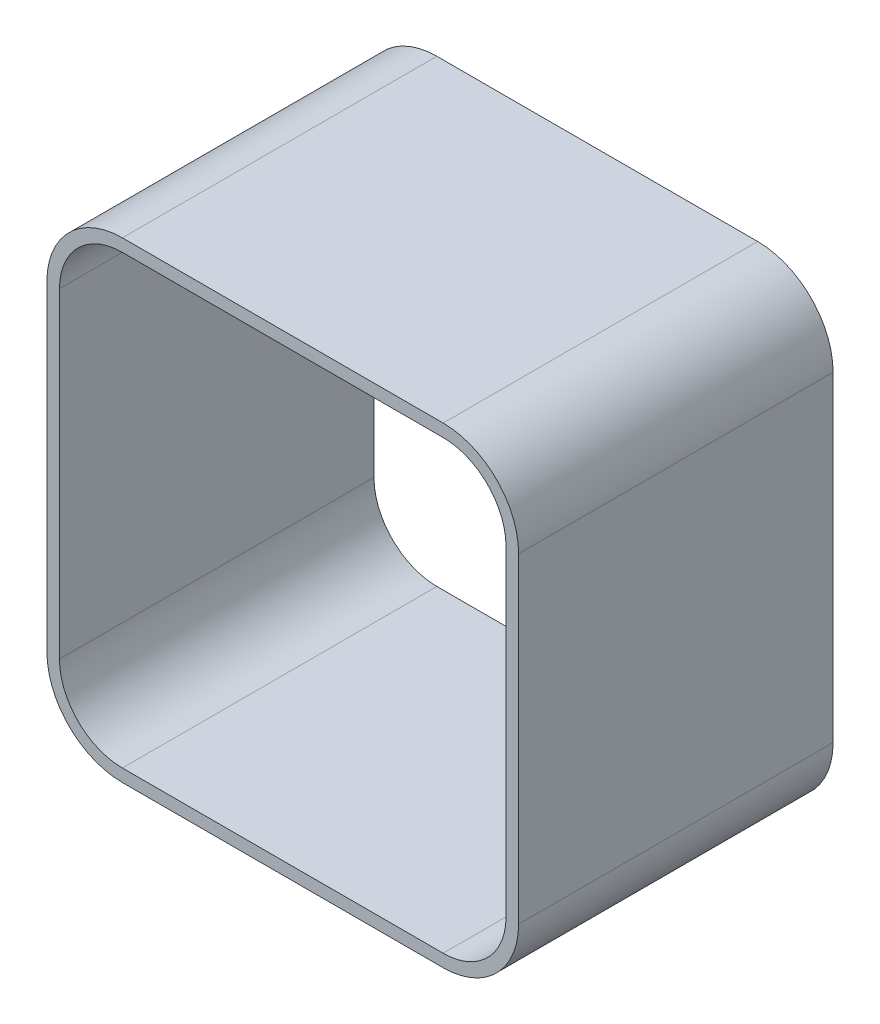
ISO-10303-21;
HEADER;
FILE_DESCRIPTION(('STEP AP214'),'2;1');
FILE_NAME('part.step','',(''),(''),'','','');
FILE_SCHEMA(('AUTOMOTIVE_DESIGN { 1 0 10303 214 1 1 1 1 }'));
ENDSEC;
DATA;
#1=APPLICATION_CONTEXT('core data for automotive mechanical design processes');
#2=APPLICATION_PROTOCOL_DEFINITION('international standard','automotive_design',2000,#1);
#3=PRODUCT_CONTEXT('',#1,'mechanical');
#4=PRODUCT('Part','Part','',(#3));
#5=PRODUCT_RELATED_PRODUCT_CATEGORY('part','',(#4));
#6=PRODUCT_DEFINITION_FORMATION('','',#4);
#7=PRODUCT_DEFINITION_CONTEXT('part definition',#1,'design');
#8=PRODUCT_DEFINITION('design','',#6,#7);
#9=PRODUCT_DEFINITION_SHAPE('','',#8);
#10=(LENGTH_UNIT() NAMED_UNIT(*) SI_UNIT(.MILLI.,.METRE.));
#11=(NAMED_UNIT(*) PLANE_ANGLE_UNIT() SI_UNIT($,.RADIAN.));
#12=(NAMED_UNIT(*) SI_UNIT($,.STERADIAN.) SOLID_ANGLE_UNIT());
#13=UNCERTAINTY_MEASURE_WITH_UNIT(LENGTH_MEASURE(1.E-05),#10,'distance_accuracy_value','');
#14=(GEOMETRIC_REPRESENTATION_CONTEXT(3) GLOBAL_UNCERTAINTY_ASSIGNED_CONTEXT((#13)) GLOBAL_UNIT_ASSIGNED_CONTEXT((#10,
#11,#12)) REPRESENTATION_CONTEXT('',''));
#15=CARTESIAN_POINT('',(0.,0.,0.));
#16=DIRECTION('',(0.,0.,1.));
#17=DIRECTION('',(1.,0.,0.));
#18=AXIS2_PLACEMENT_3D('',#15,#16,#17);
#19=CARTESIAN_POINT('',(0.,0.,10.));
#20=DIRECTION('',(0.,0.,1.));
#21=DIRECTION('',(1.,0.,0.));
#22=AXIS2_PLACEMENT_3D('',#19,#20,#21);
#23=PLANE('',#22);
#24=DIRECTION('',(-1.,0.,0.));
#25=VECTOR('',#24,1.);
#26=CARTESIAN_POINT('',(-7.5,7.5,10.));
#27=LINE('',#26,#25);
#28=CARTESIAN_POINT('',(5.1,7.5,10.));
#29=VERTEX_POINT('',#28);
#30=CARTESIAN_POINT('',(-5.1,7.5,10.));
#31=VERTEX_POINT('',#30);
#32=EDGE_CURVE('E248',#29,#31,#27,.T.);
#33=ORIENTED_EDGE('',*,*,#32,.T.);
#34=CARTESIAN_POINT('',(-5.1,5.1,10.));
#35=DIRECTION('',(0.,0.,1.));
#36=DIRECTION('',(1.,0.,0.));
#37=AXIS2_PLACEMENT_3D('',#34,#35,#36);
#38=CIRCLE('',#37,2.4);
#39=CARTESIAN_POINT('',(-7.5,5.1,10.));
#40=VERTEX_POINT('',#39);
#41=EDGE_CURVE('E230',#31,#40,#38,.T.);
#42=ORIENTED_EDGE('',*,*,#41,.T.);
#43=DIRECTION('',(0.,-1.,0.));
#44=VECTOR('',#43,1.);
#45=CARTESIAN_POINT('',(-7.5,7.5,10.));
#46=LINE('',#45,#44);
#47=CARTESIAN_POINT('',(-7.5,-5.1,10.));
#48=VERTEX_POINT('',#47);
#49=EDGE_CURVE('E176',#40,#48,#46,.T.);
#50=ORIENTED_EDGE('',*,*,#49,.T.);
#51=CARTESIAN_POINT('',(-5.1,-5.1,10.));
#52=DIRECTION('',(0.,0.,1.));
#53=DIRECTION('',(1.,0.,0.));
#54=AXIS2_PLACEMENT_3D('',#51,#52,#53);
#55=CIRCLE('',#54,2.4);
#56=CARTESIAN_POINT('',(-5.1,-7.5,10.));
#57=VERTEX_POINT('',#56);
#58=EDGE_CURVE('E53',#48,#57,#55,.T.);
#59=ORIENTED_EDGE('',*,*,#58,.T.);
#60=DIRECTION('',(1.,0.,0.));
#61=VECTOR('',#60,1.);
#62=CARTESIAN_POINT('',(-7.5,-7.5,10.));
#63=LINE('',#62,#61);
#64=CARTESIAN_POINT('',(5.1,-7.5,10.));
#65=VERTEX_POINT('',#64);
#66=EDGE_CURVE('E172',#57,#65,#63,.T.);
#67=ORIENTED_EDGE('',*,*,#66,.T.);
#68=CARTESIAN_POINT('',(5.1,-5.1,10.));
#69=DIRECTION('',(0.,0.,1.));
#70=DIRECTION('',(1.,0.,0.));
#71=AXIS2_PLACEMENT_3D('',#68,#69,#70);
#72=CIRCLE('',#71,2.4);
#73=CARTESIAN_POINT('',(7.5,-5.1,10.));
#74=VERTEX_POINT('',#73);
#75=EDGE_CURVE('E226',#65,#74,#72,.T.);
#76=ORIENTED_EDGE('',*,*,#75,.T.);
#77=DIRECTION('',(0.,1.,0.));
#78=VECTOR('',#77,1.);
#79=CARTESIAN_POINT('',(7.5,7.5,10.));
#80=LINE('',#79,#78);
#81=CARTESIAN_POINT('',(7.5,5.1,10.));
#82=VERTEX_POINT('',#81);
#83=EDGE_CURVE('E245',#74,#82,#80,.T.);
#84=ORIENTED_EDGE('',*,*,#83,.T.);
#85=CARTESIAN_POINT('',(5.1,5.1,10.));
#86=DIRECTION('',(0.,0.,1.));
#87=DIRECTION('',(1.,0.,0.));
#88=AXIS2_PLACEMENT_3D('',#85,#86,#87);
#89=CIRCLE('',#88,2.4);
#90=EDGE_CURVE('E228',#82,#29,#89,.T.);
#91=ORIENTED_EDGE('',*,*,#90,.T.);
#92=EDGE_LOOP('',(#33,#42,#50,#59,#67,#76,#84,#91));
#93=FACE_BOUND('',#92,.T.);
#94=DIRECTION('',(-1.,0.,0.));
#95=VECTOR('',#94,1.);
#96=CARTESIAN_POINT('',(-7.1,7.1,10.));
#97=LINE('',#96,#95);
#98=CARTESIAN_POINT('',(5.1,7.1,10.));
#99=VERTEX_POINT('',#98);
#100=CARTESIAN_POINT('',(-5.1,7.1,10.));
#101=VERTEX_POINT('',#100);
#102=EDGE_CURVE('E273',#99,#101,#97,.T.);
#103=ORIENTED_EDGE('',*,*,#102,.F.);
#104=CARTESIAN_POINT('',(5.1,5.1,10.));
#105=DIRECTION('',(0.,0.,1.));
#106=DIRECTION('',(1.,0.,0.));
#107=AXIS2_PLACEMENT_3D('',#104,#105,#106);
#108=CIRCLE('',#107,2.);
#109=CARTESIAN_POINT('',(7.1,5.1,10.));
#110=VERTEX_POINT('',#109);
#111=EDGE_CURVE('E158',#99,#110,#108,.F.);
#112=ORIENTED_EDGE('',*,*,#111,.T.);
#113=DIRECTION('',(0.,1.,0.));
#114=VECTOR('',#113,1.);
#115=CARTESIAN_POINT('',(7.1,7.1,10.));
#116=LINE('',#115,#114);
#117=CARTESIAN_POINT('',(7.1,-5.1,10.));
#118=VERTEX_POINT('',#117);
#119=EDGE_CURVE('E263',#118,#110,#116,.T.);
#120=ORIENTED_EDGE('',*,*,#119,.F.);
#121=CARTESIAN_POINT('',(5.1,-5.1,10.));
#122=DIRECTION('',(0.,0.,1.));
#123=DIRECTION('',(1.,0.,0.));
#124=AXIS2_PLACEMENT_3D('',#121,#122,#123);
#125=CIRCLE('',#124,2.);
#126=CARTESIAN_POINT('',(5.1,-7.1,10.));
#127=VERTEX_POINT('',#126);
#128=EDGE_CURVE('E201',#118,#127,#125,.F.);
#129=ORIENTED_EDGE('',*,*,#128,.T.);
#130=DIRECTION('',(1.,0.,0.));
#131=VECTOR('',#130,1.);
#132=CARTESIAN_POINT('',(-7.1,-7.1,10.));
#133=LINE('',#132,#131);
#134=CARTESIAN_POINT('',(-5.1,-7.1,10.));
#135=VERTEX_POINT('',#134);
#136=EDGE_CURVE('E258',#135,#127,#133,.T.);
#137=ORIENTED_EDGE('',*,*,#136,.F.);
#138=CARTESIAN_POINT('',(-5.1,-5.1,10.));
#139=DIRECTION('',(0.,0.,1.));
#140=DIRECTION('',(1.,0.,0.));
#141=AXIS2_PLACEMENT_3D('',#138,#139,#140);
#142=CIRCLE('',#141,2.);
#143=CARTESIAN_POINT('',(-7.1,-5.1,10.));
#144=VERTEX_POINT('',#143);
#145=EDGE_CURVE('E197',#135,#144,#142,.F.);
#146=ORIENTED_EDGE('',*,*,#145,.T.);
#147=DIRECTION('',(0.,-1.,0.));
#148=VECTOR('',#147,1.);
#149=CARTESIAN_POINT('',(-7.1,7.1,10.));
#150=LINE('',#149,#148);
#151=CARTESIAN_POINT('',(-7.1,5.1,10.));
#152=VERTEX_POINT('',#151);
#153=EDGE_CURVE('E271',#152,#144,#150,.T.);
#154=ORIENTED_EDGE('',*,*,#153,.F.);
#155=CARTESIAN_POINT('',(-5.1,5.1,10.));
#156=DIRECTION('',(0.,0.,1.));
#157=DIRECTION('',(1.,0.,0.));
#158=AXIS2_PLACEMENT_3D('',#155,#156,#157);
#159=CIRCLE('',#158,2.);
#160=EDGE_CURVE('E157',#152,#101,#159,.F.);
#161=ORIENTED_EDGE('',*,*,#160,.T.);
#162=EDGE_LOOP('',(#103,#112,#120,#129,#137,#146,#154,#161));
#163=FACE_BOUND('',#162,.T.);
#164=ADVANCED_FACE('F33',(#93,#163),#23,.T.);
#165=CARTESIAN_POINT('',(0.,0.,0.));
#166=DIRECTION('',(0.,0.,1.));
#167=DIRECTION('',(1.,0.,0.));
#168=AXIS2_PLACEMENT_3D('',#165,#166,#167);
#169=PLANE('',#168);
#170=DIRECTION('',(0.,-1.,0.));
#171=VECTOR('',#170,1.);
#172=CARTESIAN_POINT('',(-7.5,7.5,0.));
#173=LINE('',#172,#171);
#174=CARTESIAN_POINT('',(-7.5,5.1,0.));
#175=VERTEX_POINT('',#174);
#176=CARTESIAN_POINT('',(-7.5,-5.1,0.));
#177=VERTEX_POINT('',#176);
#178=EDGE_CURVE('E246',#175,#177,#173,.T.);
#179=ORIENTED_EDGE('',*,*,#178,.F.);
#180=CARTESIAN_POINT('',(-5.1,5.1,0.));
#181=DIRECTION('',(0.,0.,1.));
#182=DIRECTION('',(1.,0.,0.));
#183=AXIS2_PLACEMENT_3D('',#180,#181,#182);
#184=CIRCLE('',#183,2.4);
#185=CARTESIAN_POINT('',(-5.1,7.5,0.));
#186=VERTEX_POINT('',#185);
#187=EDGE_CURVE('E218',#175,#186,#184,.F.);
#188=ORIENTED_EDGE('',*,*,#187,.T.);
#189=DIRECTION('',(-1.,0.,0.));
#190=VECTOR('',#189,1.);
#191=CARTESIAN_POINT('',(-7.5,7.5,0.));
#192=LINE('',#191,#190);
#193=CARTESIAN_POINT('',(5.1,7.5,0.));
#194=VERTEX_POINT('',#193);
#195=EDGE_CURVE('E250',#194,#186,#192,.T.);
#196=ORIENTED_EDGE('',*,*,#195,.F.);
#197=CARTESIAN_POINT('',(5.1,5.1,0.));
#198=DIRECTION('',(0.,0.,1.));
#199=DIRECTION('',(1.,0.,0.));
#200=AXIS2_PLACEMENT_3D('',#197,#198,#199);
#201=CIRCLE('',#200,2.4);
#202=CARTESIAN_POINT('',(7.5,5.1,0.));
#203=VERTEX_POINT('',#202);
#204=EDGE_CURVE('E216',#194,#203,#201,.F.);
#205=ORIENTED_EDGE('',*,*,#204,.T.);
#206=DIRECTION('',(0.,1.,0.));
#207=VECTOR('',#206,1.);
#208=CARTESIAN_POINT('',(7.5,7.5,0.));
#209=LINE('',#208,#207);
#210=CARTESIAN_POINT('',(7.5,-5.1,0.));
#211=VERTEX_POINT('',#210);
#212=EDGE_CURVE('E254',#211,#203,#209,.T.);
#213=ORIENTED_EDGE('',*,*,#212,.F.);
#214=CARTESIAN_POINT('',(5.1,-5.1,0.));
#215=DIRECTION('',(0.,0.,1.));
#216=DIRECTION('',(1.,0.,0.));
#217=AXIS2_PLACEMENT_3D('',#214,#215,#216);
#218=CIRCLE('',#217,2.4);
#219=CARTESIAN_POINT('',(5.1,-7.5,0.));
#220=VERTEX_POINT('',#219);
#221=EDGE_CURVE('E214',#211,#220,#218,.F.);
#222=ORIENTED_EDGE('',*,*,#221,.T.);
#223=DIRECTION('',(1.,0.,0.));
#224=VECTOR('',#223,1.);
#225=CARTESIAN_POINT('',(-7.5,-7.5,0.));
#226=LINE('',#225,#224);
#227=CARTESIAN_POINT('',(-5.1,-7.5,0.));
#228=VERTEX_POINT('',#227);
#229=EDGE_CURVE('E179',#228,#220,#226,.T.);
#230=ORIENTED_EDGE('',*,*,#229,.F.);
#231=CARTESIAN_POINT('',(-5.1,-5.1,0.));
#232=DIRECTION('',(0.,0.,1.));
#233=DIRECTION('',(1.,0.,0.));
#234=AXIS2_PLACEMENT_3D('',#231,#232,#233);
#235=CIRCLE('',#234,2.4);
#236=EDGE_CURVE('E212',#228,#177,#235,.F.);
#237=ORIENTED_EDGE('',*,*,#236,.T.);
#238=EDGE_LOOP('',(#179,#188,#196,#205,#213,#222,#230,#237));
#239=FACE_BOUND('',#238,.T.);
#240=DIRECTION('',(1.,0.,0.));
#241=VECTOR('',#240,1.);
#242=CARTESIAN_POINT('',(-7.1,-7.1,0.));
#243=LINE('',#242,#241);
#244=CARTESIAN_POINT('',(-5.1,-7.1,0.));
#245=VERTEX_POINT('',#244);
#246=CARTESIAN_POINT('',(5.1,-7.1,0.));
#247=VERTEX_POINT('',#246);
#248=EDGE_CURVE('E168',#245,#247,#243,.T.);
#249=ORIENTED_EDGE('',*,*,#248,.T.);
#250=CARTESIAN_POINT('',(5.1,-5.1,0.));
#251=DIRECTION('',(0.,0.,1.));
#252=DIRECTION('',(1.,0.,0.));
#253=AXIS2_PLACEMENT_3D('',#250,#251,#252);
#254=CIRCLE('',#253,2.);
#255=CARTESIAN_POINT('',(7.1,-5.1,0.));
#256=VERTEX_POINT('',#255);
#257=EDGE_CURVE('E199',#247,#256,#254,.T.);
#258=ORIENTED_EDGE('',*,*,#257,.T.);
#259=DIRECTION('',(0.,1.,0.));
#260=VECTOR('',#259,1.);
#261=CARTESIAN_POINT('',(7.1,7.1,0.));
#262=LINE('',#261,#260);
#263=CARTESIAN_POINT('',(7.1,5.1,0.));
#264=VERTEX_POINT('',#263);
#265=EDGE_CURVE('E266',#256,#264,#262,.T.);
#266=ORIENTED_EDGE('',*,*,#265,.T.);
#267=CARTESIAN_POINT('',(5.1,5.1,0.));
#268=DIRECTION('',(0.,0.,1.));
#269=DIRECTION('',(1.,0.,0.));
#270=AXIS2_PLACEMENT_3D('',#267,#268,#269);
#271=CIRCLE('',#270,2.);
#272=CARTESIAN_POINT('',(5.1,7.1,0.));
#273=VERTEX_POINT('',#272);
#274=EDGE_CURVE('E203',#264,#273,#271,.T.);
#275=ORIENTED_EDGE('',*,*,#274,.T.);
#276=DIRECTION('',(-1.,0.,0.));
#277=VECTOR('',#276,1.);
#278=CARTESIAN_POINT('',(-7.1,7.1,0.));
#279=LINE('',#278,#277);
#280=CARTESIAN_POINT('',(-5.1,7.1,0.));
#281=VERTEX_POINT('',#280);
#282=EDGE_CURVE('E152',#273,#281,#279,.T.);
#283=ORIENTED_EDGE('',*,*,#282,.T.);
#284=CARTESIAN_POINT('',(-5.1,5.1,0.));
#285=DIRECTION('',(0.,0.,1.));
#286=DIRECTION('',(1.,0.,0.));
#287=AXIS2_PLACEMENT_3D('',#284,#285,#286);
#288=CIRCLE('',#287,2.);
#289=CARTESIAN_POINT('',(-7.1,5.1,0.));
#290=VERTEX_POINT('',#289);
#291=EDGE_CURVE('E146',#281,#290,#288,.T.);
#292=ORIENTED_EDGE('',*,*,#291,.T.);
#293=DIRECTION('',(0.,-1.,0.));
#294=VECTOR('',#293,1.);
#295=CARTESIAN_POINT('',(-7.1,7.1,0.));
#296=LINE('',#295,#294);
#297=CARTESIAN_POINT('',(-7.1,-5.1,0.));
#298=VERTEX_POINT('',#297);
#299=EDGE_CURVE('E150',#290,#298,#296,.T.);
#300=ORIENTED_EDGE('',*,*,#299,.T.);
#301=CARTESIAN_POINT('',(-5.1,-5.1,0.));
#302=DIRECTION('',(0.,0.,1.));
#303=DIRECTION('',(1.,0.,0.));
#304=AXIS2_PLACEMENT_3D('',#301,#302,#303);
#305=CIRCLE('',#304,2.);
#306=EDGE_CURVE('E195',#298,#245,#305,.T.);
#307=ORIENTED_EDGE('',*,*,#306,.T.);
#308=EDGE_LOOP('',(#249,#258,#266,#275,#283,#292,#300,#307));
#309=FACE_BOUND('',#308,.T.);
#310=ADVANCED_FACE('F149',(#239,#309),#169,.F.);
#311=CARTESIAN_POINT('',(7.5,7.5,10.));
#312=DIRECTION('',(-1.,0.,0.));
#313=DIRECTION('',(0.,-1.,0.));
#314=AXIS2_PLACEMENT_3D('',#311,#312,#313);
#315=PLANE('',#314);
#316=ORIENTED_EDGE('',*,*,#212,.T.);
#317=DIRECTION('',(0.,0.,-1.));
#318=VECTOR('',#317,1.);
#319=CARTESIAN_POINT('',(7.5,5.1,10.));
#320=LINE('',#319,#318);
#321=EDGE_CURVE('E235',#203,#82,#320,.F.);
#322=ORIENTED_EDGE('',*,*,#321,.T.);
#323=ORIENTED_EDGE('',*,*,#83,.F.);
#324=DIRECTION('',(0.,0.,-1.));
#325=VECTOR('',#324,1.);
#326=CARTESIAN_POINT('',(7.5,-5.1,10.));
#327=LINE('',#326,#325);
#328=EDGE_CURVE('E232',#74,#211,#327,.T.);
#329=ORIENTED_EDGE('',*,*,#328,.T.);
#330=EDGE_LOOP('',(#316,#322,#323,#329));
#331=FACE_BOUND('',#330,.T.);
#332=ADVANCED_FACE('F316',(#331),#315,.F.);
#333=CARTESIAN_POINT('',(-7.5,7.5,10.));
#334=DIRECTION('',(0.,-1.,0.));
#335=DIRECTION('',(0.,0.,-1.));
#336=AXIS2_PLACEMENT_3D('',#333,#334,#335);
#337=PLANE('',#336);
#338=ORIENTED_EDGE('',*,*,#195,.T.);
#339=DIRECTION('',(0.,0.,-1.));
#340=VECTOR('',#339,1.);
#341=CARTESIAN_POINT('',(-5.1,7.5,10.));
#342=LINE('',#341,#340);
#343=EDGE_CURVE('E223',#186,#31,#342,.F.);
#344=ORIENTED_EDGE('',*,*,#343,.T.);
#345=ORIENTED_EDGE('',*,*,#32,.F.);
#346=DIRECTION('',(0.,0.,-1.));
#347=VECTOR('',#346,1.);
#348=CARTESIAN_POINT('',(5.1,7.5,10.));
#349=LINE('',#348,#347);
#350=EDGE_CURVE('E220',#29,#194,#349,.T.);
#351=ORIENTED_EDGE('',*,*,#350,.T.);
#352=EDGE_LOOP('',(#338,#344,#345,#351));
#353=FACE_BOUND('',#352,.T.);
#354=ADVANCED_FACE('F326',(#353),#337,.F.);
#355=CARTESIAN_POINT('',(-7.5,7.5,10.));
#356=DIRECTION('',(1.,0.,0.));
#357=DIRECTION('',(0.,1.,0.));
#358=AXIS2_PLACEMENT_3D('',#355,#356,#357);
#359=PLANE('',#358);
#360=ORIENTED_EDGE('',*,*,#49,.F.);
#361=DIRECTION('',(0.,0.,-1.));
#362=VECTOR('',#361,1.);
#363=CARTESIAN_POINT('',(-7.5,5.1,10.));
#364=LINE('',#363,#362);
#365=EDGE_CURVE('E209',#40,#175,#364,.T.);
#366=ORIENTED_EDGE('',*,*,#365,.T.);
#367=ORIENTED_EDGE('',*,*,#178,.T.);
#368=DIRECTION('',(0.,0.,-1.));
#369=VECTOR('',#368,1.);
#370=CARTESIAN_POINT('',(-7.5,-5.1,10.));
#371=LINE('',#370,#369);
#372=EDGE_CURVE('E207',#177,#48,#371,.F.);
#373=ORIENTED_EDGE('',*,*,#372,.T.);
#374=EDGE_LOOP('',(#360,#366,#367,#373));
#375=FACE_BOUND('',#374,.T.);
#376=ADVANCED_FACE('F323',(#375),#359,.F.);
#377=CARTESIAN_POINT('',(-7.5,-7.5,10.));
#378=DIRECTION('',(0.,1.,0.));
#379=DIRECTION('',(0.,0.,1.));
#380=AXIS2_PLACEMENT_3D('',#377,#378,#379);
#381=PLANE('',#380);
#382=ORIENTED_EDGE('',*,*,#229,.T.);
#383=DIRECTION('',(0.,0.,-1.));
#384=VECTOR('',#383,1.);
#385=CARTESIAN_POINT('',(5.1,-7.5,10.));
#386=LINE('',#385,#384);
#387=EDGE_CURVE('E11',#220,#65,#386,.F.);
#388=ORIENTED_EDGE('',*,*,#387,.T.);
#389=ORIENTED_EDGE('',*,*,#66,.F.);
#390=DIRECTION('',(0.,0.,-1.));
#391=VECTOR('',#390,1.);
#392=CARTESIAN_POINT('',(-5.1,-7.5,10.));
#393=LINE('',#392,#391);
#394=EDGE_CURVE('E41',#57,#228,#393,.T.);
#395=ORIENTED_EDGE('',*,*,#394,.T.);
#396=EDGE_LOOP('',(#382,#388,#389,#395));
#397=FACE_BOUND('',#396,.T.);
#398=ADVANCED_FACE('F239',(#397),#381,.F.);
#399=CARTESIAN_POINT('',(7.1,7.1,10.));
#400=DIRECTION('',(-1.,0.,0.));
#401=DIRECTION('',(0.,-1.,0.));
#402=AXIS2_PLACEMENT_3D('',#399,#400,#401);
#403=PLANE('',#402);
#404=ORIENTED_EDGE('',*,*,#265,.F.);
#405=DIRECTION('',(0.,0.,-1.));
#406=VECTOR('',#405,1.);
#407=CARTESIAN_POINT('',(7.1,-5.1,10.));
#408=LINE('',#407,#406);
#409=EDGE_CURVE('E189',#256,#118,#408,.F.);
#410=ORIENTED_EDGE('',*,*,#409,.T.);
#411=ORIENTED_EDGE('',*,*,#119,.T.);
#412=DIRECTION('',(0.,0.,-1.));
#413=VECTOR('',#412,1.);
#414=CARTESIAN_POINT('',(7.1,5.1,0.));
#415=LINE('',#414,#413);
#416=EDGE_CURVE('E186',#110,#264,#415,.T.);
#417=ORIENTED_EDGE('',*,*,#416,.T.);
#418=EDGE_LOOP('',(#404,#410,#411,#417));
#419=FACE_BOUND('',#418,.T.);
#420=ADVANCED_FACE('F281',(#419),#403,.T.);
#421=CARTESIAN_POINT('',(-7.1,7.1,10.));
#422=DIRECTION('',(0.,-1.,0.));
#423=DIRECTION('',(1.,0.,0.));
#424=AXIS2_PLACEMENT_3D('',#421,#422,#423);
#425=PLANE('',#424);
#426=ORIENTED_EDGE('',*,*,#282,.F.);
#427=DIRECTION('',(0.,0.,-1.));
#428=VECTOR('',#427,1.);
#429=CARTESIAN_POINT('',(5.1,7.1,10.));
#430=LINE('',#429,#428);
#431=EDGE_CURVE('E193',#273,#99,#430,.F.);
#432=ORIENTED_EDGE('',*,*,#431,.T.);
#433=ORIENTED_EDGE('',*,*,#102,.T.);
#434=DIRECTION('',(0.,0.,-1.));
#435=VECTOR('',#434,1.);
#436=CARTESIAN_POINT('',(-5.1,7.1,0.));
#437=LINE('',#436,#435);
#438=EDGE_CURVE('E191',#101,#281,#437,.T.);
#439=ORIENTED_EDGE('',*,*,#438,.T.);
#440=EDGE_LOOP('',(#426,#432,#433,#439));
#441=FACE_BOUND('',#440,.T.);
#442=ADVANCED_FACE('F290',(#441),#425,.T.);
#443=CARTESIAN_POINT('',(-7.1,7.1,10.));
#444=DIRECTION('',(1.,0.,0.));
#445=DIRECTION('',(0.,0.,-1.));
#446=AXIS2_PLACEMENT_3D('',#443,#444,#445);
#447=PLANE('',#446);
#448=ORIENTED_EDGE('',*,*,#153,.T.);
#449=DIRECTION('',(0.,0.,-1.));
#450=VECTOR('',#449,1.);
#451=CARTESIAN_POINT('',(-7.1,-5.1,0.));
#452=LINE('',#451,#450);
#453=EDGE_CURVE('E167',#144,#298,#452,.T.);
#454=ORIENTED_EDGE('',*,*,#453,.T.);
#455=ORIENTED_EDGE('',*,*,#299,.F.);
#456=DIRECTION('',(0.,0.,-1.));
#457=VECTOR('',#456,1.);
#458=CARTESIAN_POINT('',(-7.1,5.1,10.));
#459=LINE('',#458,#457);
#460=EDGE_CURVE('E164',#290,#152,#459,.F.);
#461=ORIENTED_EDGE('',*,*,#460,.T.);
#462=EDGE_LOOP('',(#448,#454,#455,#461));
#463=FACE_BOUND('',#462,.T.);
#464=ADVANCED_FACE('F163',(#463),#447,.T.);
#465=CARTESIAN_POINT('',(-7.1,-7.1,10.));
#466=DIRECTION('',(0.,1.,0.));
#467=DIRECTION('',(0.,0.,1.));
#468=AXIS2_PLACEMENT_3D('',#465,#466,#467);
#469=PLANE('',#468);
#470=ORIENTED_EDGE('',*,*,#248,.F.);
#471=DIRECTION('',(0.,0.,-1.));
#472=VECTOR('',#471,1.);
#473=CARTESIAN_POINT('',(-5.1,-7.1,10.));
#474=LINE('',#473,#472);
#475=EDGE_CURVE('E184',#245,#135,#474,.F.);
#476=ORIENTED_EDGE('',*,*,#475,.T.);
#477=ORIENTED_EDGE('',*,*,#136,.T.);
#478=DIRECTION('',(0.,0.,-1.));
#479=VECTOR('',#478,1.);
#480=CARTESIAN_POINT('',(5.1,-7.1,0.));
#481=LINE('',#480,#479);
#482=EDGE_CURVE('E174',#127,#247,#481,.T.);
#483=ORIENTED_EDGE('',*,*,#482,.T.);
#484=EDGE_LOOP('',(#470,#476,#477,#483));
#485=FACE_BOUND('',#484,.T.);
#486=ADVANCED_FACE('F299',(#485),#469,.T.);
#487=CARTESIAN_POINT('',(-5.1,-5.1,10.));
#488=DIRECTION('',(0.,0.,1.));
#489=DIRECTION('',(1.,0.,0.));
#490=AXIS2_PLACEMENT_3D('',#487,#488,#489);
#491=CYLINDRICAL_SURFACE('',#490,2.);
#492=ORIENTED_EDGE('',*,*,#145,.F.);
#493=ORIENTED_EDGE('',*,*,#475,.F.);
#494=ORIENTED_EDGE('',*,*,#306,.F.);
#495=ORIENTED_EDGE('',*,*,#453,.F.);
#496=EDGE_LOOP('',(#492,#493,#494,#495));
#497=FACE_BOUND('',#496,.T.);
#498=ADVANCED_FACE('F295',(#497),#491,.F.);
#499=CARTESIAN_POINT('',(5.1,-5.1,10.));
#500=DIRECTION('',(0.,0.,1.));
#501=DIRECTION('',(1.,0.,0.));
#502=AXIS2_PLACEMENT_3D('',#499,#500,#501);
#503=CYLINDRICAL_SURFACE('',#502,2.);
#504=ORIENTED_EDGE('',*,*,#128,.F.);
#505=ORIENTED_EDGE('',*,*,#409,.F.);
#506=ORIENTED_EDGE('',*,*,#257,.F.);
#507=ORIENTED_EDGE('',*,*,#482,.F.);
#508=EDGE_LOOP('',(#504,#505,#506,#507));
#509=FACE_BOUND('',#508,.T.);
#510=ADVANCED_FACE('F302',(#509),#503,.F.);
#511=CARTESIAN_POINT('',(5.1,5.1,10.));
#512=DIRECTION('',(0.,0.,1.));
#513=DIRECTION('',(1.,0.,0.));
#514=AXIS2_PLACEMENT_3D('',#511,#512,#513);
#515=CYLINDRICAL_SURFACE('',#514,2.);
#516=ORIENTED_EDGE('',*,*,#111,.F.);
#517=ORIENTED_EDGE('',*,*,#431,.F.);
#518=ORIENTED_EDGE('',*,*,#274,.F.);
#519=ORIENTED_EDGE('',*,*,#416,.F.);
#520=EDGE_LOOP('',(#516,#517,#518,#519));
#521=FACE_BOUND('',#520,.T.);
#522=ADVANCED_FACE('F287',(#521),#515,.F.);
#523=CARTESIAN_POINT('',(-5.1,5.1,10.));
#524=DIRECTION('',(0.,0.,1.));
#525=DIRECTION('',(1.,0.,0.));
#526=AXIS2_PLACEMENT_3D('',#523,#524,#525);
#527=CYLINDRICAL_SURFACE('',#526,2.);
#528=ORIENTED_EDGE('',*,*,#160,.F.);
#529=ORIENTED_EDGE('',*,*,#460,.F.);
#530=ORIENTED_EDGE('',*,*,#291,.F.);
#531=ORIENTED_EDGE('',*,*,#438,.F.);
#532=EDGE_LOOP('',(#528,#529,#530,#531));
#533=FACE_BOUND('',#532,.T.);
#534=ADVANCED_FACE('F171',(#533),#527,.F.);
#535=CARTESIAN_POINT('',(-5.1,5.1,10.));
#536=DIRECTION('',(0.,0.,-1.));
#537=DIRECTION('',(-1.,0.,0.));
#538=AXIS2_PLACEMENT_3D('',#535,#536,#537);
#539=CYLINDRICAL_SURFACE('',#538,2.4);
#540=ORIENTED_EDGE('',*,*,#41,.F.);
#541=ORIENTED_EDGE('',*,*,#343,.F.);
#542=ORIENTED_EDGE('',*,*,#187,.F.);
#543=ORIENTED_EDGE('',*,*,#365,.F.);
#544=EDGE_LOOP('',(#540,#541,#542,#543));
#545=FACE_BOUND('',#544,.T.);
#546=ADVANCED_FACE('F346',(#545),#539,.T.);
#547=CARTESIAN_POINT('',(5.1,5.1,10.));
#548=DIRECTION('',(0.,0.,-1.));
#549=DIRECTION('',(-1.,0.,0.));
#550=AXIS2_PLACEMENT_3D('',#547,#548,#549);
#551=CYLINDRICAL_SURFACE('',#550,2.4);
#552=ORIENTED_EDGE('',*,*,#90,.F.);
#553=ORIENTED_EDGE('',*,*,#321,.F.);
#554=ORIENTED_EDGE('',*,*,#204,.F.);
#555=ORIENTED_EDGE('',*,*,#350,.F.);
#556=EDGE_LOOP('',(#552,#553,#554,#555));
#557=FACE_BOUND('',#556,.T.);
#558=ADVANCED_FACE('F339',(#557),#551,.T.);
#559=CARTESIAN_POINT('',(5.1,-5.1,10.));
#560=DIRECTION('',(0.,0.,-1.));
#561=DIRECTION('',(-1.,0.,0.));
#562=AXIS2_PLACEMENT_3D('',#559,#560,#561);
#563=CYLINDRICAL_SURFACE('',#562,2.4);
#564=ORIENTED_EDGE('',*,*,#75,.F.);
#565=ORIENTED_EDGE('',*,*,#387,.F.);
#566=ORIENTED_EDGE('',*,*,#221,.F.);
#567=ORIENTED_EDGE('',*,*,#328,.F.);
#568=EDGE_LOOP('',(#564,#565,#566,#567));
#569=FACE_BOUND('',#568,.T.);
#570=ADVANCED_FACE('F350',(#569),#563,.T.);
#571=CARTESIAN_POINT('',(-5.1,-5.1,10.));
#572=DIRECTION('',(0.,0.,-1.));
#573=DIRECTION('',(-1.,0.,0.));
#574=AXIS2_PLACEMENT_3D('',#571,#572,#573);
#575=CYLINDRICAL_SURFACE('',#574,2.4);
#576=ORIENTED_EDGE('',*,*,#58,.F.);
#577=ORIENTED_EDGE('',*,*,#372,.F.);
#578=ORIENTED_EDGE('',*,*,#236,.F.);
#579=ORIENTED_EDGE('',*,*,#394,.F.);
#580=EDGE_LOOP('',(#576,#577,#578,#579));
#581=FACE_BOUND('',#580,.T.);
#582=ADVANCED_FACE('F35',(#581),#575,.T.);
#583=CLOSED_SHELL('',(#164,#310,#332,#354,#376,#398,#420,#442,#464,#486,#498,#510,#522,#534,
#546,#558,#570,#582));
#584=MANIFOLD_SOLID_BREP('B2',#583);
#585=ADVANCED_BREP_SHAPE_REPRESENTATION('',(#18,#584),#14);
#586=SHAPE_DEFINITION_REPRESENTATION(#9,#585);
ENDSEC;
END-ISO-10303-21;
